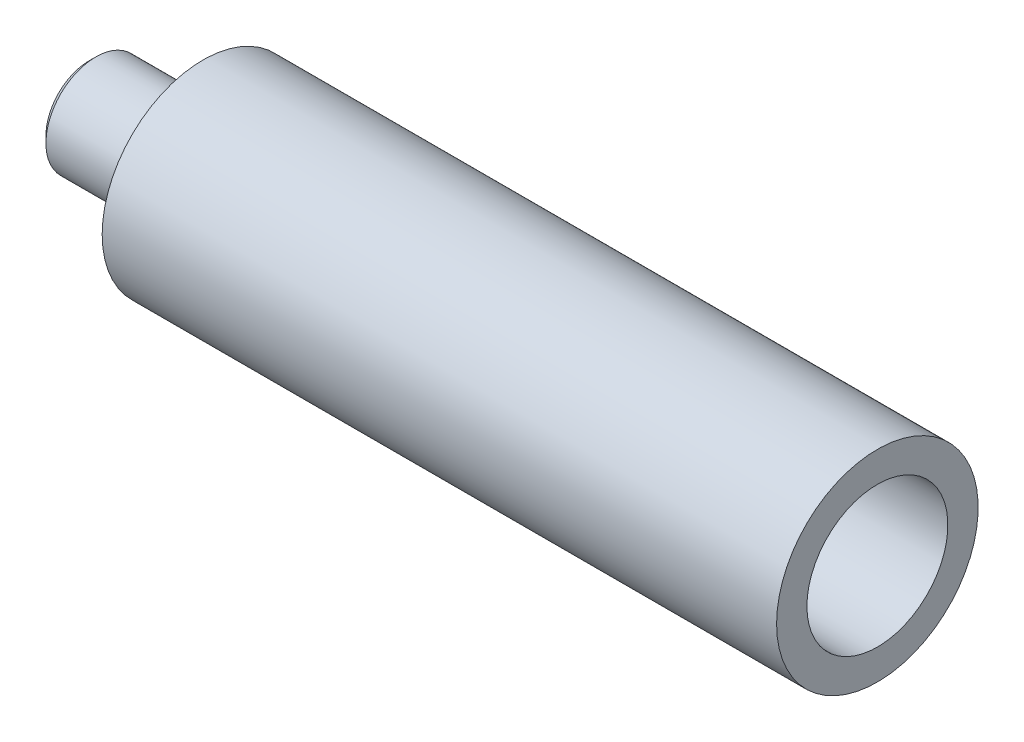
ISO-10303-21;
HEADER;
FILE_DESCRIPTION(('STEP AP214'),'2;1');
FILE_NAME('part.step','',(''),(''),'','','');
FILE_SCHEMA(('AUTOMOTIVE_DESIGN { 1 0 10303 214 1 1 1 1 }'));
ENDSEC;
DATA;
#1=APPLICATION_CONTEXT('core data for automotive mechanical design processes');
#2=APPLICATION_PROTOCOL_DEFINITION('international standard','automotive_design',2000,#1);
#3=PRODUCT_CONTEXT('',#1,'mechanical');
#4=PRODUCT('Part','Part','',(#3));
#5=PRODUCT_RELATED_PRODUCT_CATEGORY('part','',(#4));
#6=PRODUCT_DEFINITION_FORMATION('','',#4);
#7=PRODUCT_DEFINITION_CONTEXT('part definition',#1,'design');
#8=PRODUCT_DEFINITION('design','',#6,#7);
#9=PRODUCT_DEFINITION_SHAPE('','',#8);
#10=(LENGTH_UNIT() NAMED_UNIT(*) SI_UNIT(.MILLI.,.METRE.));
#11=(NAMED_UNIT(*) PLANE_ANGLE_UNIT() SI_UNIT($,.RADIAN.));
#12=(NAMED_UNIT(*) SI_UNIT($,.STERADIAN.) SOLID_ANGLE_UNIT());
#13=UNCERTAINTY_MEASURE_WITH_UNIT(LENGTH_MEASURE(1.E-05),#10,'distance_accuracy_value','');
#14=(GEOMETRIC_REPRESENTATION_CONTEXT(3) GLOBAL_UNCERTAINTY_ASSIGNED_CONTEXT((#13)) GLOBAL_UNIT_ASSIGNED_CONTEXT((#10,
#11,#12)) REPRESENTATION_CONTEXT('',''));
#15=CARTESIAN_POINT('',(0.,0.,0.));
#16=DIRECTION('',(0.,0.,1.));
#17=DIRECTION('',(1.,0.,0.));
#18=AXIS2_PLACEMENT_3D('',#15,#16,#17);
#19=CARTESIAN_POINT('',(0.,0.,0.));
#20=DIRECTION('',(1.,0.,0.));
#21=DIRECTION('',(0.,0.,-1.));
#22=AXIS2_PLACEMENT_3D('',#19,#20,#21);
#23=PLANE('',#22);
#24=CARTESIAN_POINT('',(0.,0.,0.));
#25=DIRECTION('',(-1.,0.,0.));
#26=DIRECTION('',(0.,0.,1.));
#27=AXIS2_PLACEMENT_3D('',#24,#25,#26);
#28=CIRCLE('',#27,3.);
#29=CARTESIAN_POINT('',(0.,0.,3.));
#30=VERTEX_POINT('',#29);
#31=EDGE_CURVE('E77',#30,#30,#28,.T.);
#32=ORIENTED_EDGE('',*,*,#31,.F.);
#33=EDGE_LOOP('',(#32));
#34=FACE_BOUND('',#33,.T.);
#35=CARTESIAN_POINT('',(0.,0.,0.));
#36=DIRECTION('',(1.,0.,0.));
#37=DIRECTION('',(0.,0.,-1.));
#38=AXIS2_PLACEMENT_3D('',#35,#36,#37);
#39=CIRCLE('',#38,5.7225);
#40=CARTESIAN_POINT('',(0.,0.,-5.7225));
#41=VERTEX_POINT('',#40);
#42=EDGE_CURVE('E89',#41,#41,#39,.T.);
#43=ORIENTED_EDGE('',*,*,#42,.F.);
#44=EDGE_LOOP('',(#43));
#45=FACE_BOUND('',#44,.T.);
#46=ADVANCED_FACE('F49',(#34,#45),#23,.F.);
#47=CARTESIAN_POINT('',(0.,0.,0.));
#48=DIRECTION('',(-1.,0.,0.));
#49=DIRECTION('',(0.,0.,1.));
#50=AXIS2_PLACEMENT_3D('',#47,#48,#49);
#51=CYLINDRICAL_SURFACE('',#50,13.3);
#52=CARTESIAN_POINT('',(104.,0.,0.));
#53=DIRECTION('',(-1.,0.,0.));
#54=DIRECTION('',(0.,0.,1.));
#55=AXIS2_PLACEMENT_3D('',#52,#53,#54);
#56=CIRCLE('',#55,13.3);
#57=CARTESIAN_POINT('',(104.,0.,13.3));
#58=VERTEX_POINT('',#57);
#59=EDGE_CURVE('E10',#58,#58,#56,.T.);
#60=ORIENTED_EDGE('',*,*,#59,.T.);
#61=EDGE_LOOP('',(#60));
#62=FACE_BOUND('',#61,.T.);
#63=CARTESIAN_POINT('',(15.,0.,0.));
#64=DIRECTION('',(-1.,0.,0.));
#65=DIRECTION('',(0.,0.,1.));
#66=AXIS2_PLACEMENT_3D('',#63,#64,#65);
#67=CIRCLE('',#66,13.3);
#68=CARTESIAN_POINT('',(15.,0.,13.3));
#69=VERTEX_POINT('',#68);
#70=EDGE_CURVE('E81',#69,#69,#67,.T.);
#71=ORIENTED_EDGE('',*,*,#70,.F.);
#72=EDGE_LOOP('',(#71));
#73=FACE_BOUND('',#72,.T.);
#74=ADVANCED_FACE('F51',(#62,#73),#51,.T.);
#75=CARTESIAN_POINT('',(104.,0.,0.));
#76=DIRECTION('',(1.,0.,0.));
#77=DIRECTION('',(0.,0.,-1.));
#78=AXIS2_PLACEMENT_3D('',#75,#76,#77);
#79=PLANE('',#78);
#80=CARTESIAN_POINT('',(104.,0.,0.));
#81=DIRECTION('',(-1.,0.,0.));
#82=DIRECTION('',(0.,0.,1.));
#83=AXIS2_PLACEMENT_3D('',#80,#81,#82);
#84=CIRCLE('',#83,9.3);
#85=CARTESIAN_POINT('',(104.,0.,9.3));
#86=VERTEX_POINT('',#85);
#87=EDGE_CURVE('E57',#86,#86,#84,.T.);
#88=ORIENTED_EDGE('',*,*,#87,.T.);
#89=EDGE_LOOP('',(#88));
#90=FACE_BOUND('',#89,.T.);
#91=ORIENTED_EDGE('',*,*,#59,.F.);
#92=EDGE_LOOP('',(#91));
#93=FACE_BOUND('',#92,.T.);
#94=ADVANCED_FACE('F114',(#90,#93),#79,.T.);
#95=CARTESIAN_POINT('',(0.,0.,0.));
#96=DIRECTION('',(-1.,0.,0.));
#97=DIRECTION('',(0.,0.,1.));
#98=AXIS2_PLACEMENT_3D('',#95,#96,#97);
#99=CYLINDRICAL_SURFACE('',#98,9.3);
#100=ORIENTED_EDGE('',*,*,#87,.F.);
#101=EDGE_LOOP('',(#100));
#102=FACE_BOUND('',#101,.T.);
#103=CARTESIAN_POINT('',(19.,0.,0.));
#104=DIRECTION('',(-1.,0.,0.));
#105=DIRECTION('',(0.,0.,1.));
#106=AXIS2_PLACEMENT_3D('',#103,#104,#105);
#107=CIRCLE('',#106,9.3);
#108=CARTESIAN_POINT('',(19.,0.,9.3));
#109=VERTEX_POINT('',#108);
#110=EDGE_CURVE('E64',#109,#109,#107,.T.);
#111=ORIENTED_EDGE('',*,*,#110,.T.);
#112=EDGE_LOOP('',(#111));
#113=FACE_BOUND('',#112,.T.);
#114=ADVANCED_FACE('F127',(#102,#113),#99,.F.);
#115=CARTESIAN_POINT('',(19.,0.,0.));
#116=DIRECTION('',(-1.,0.,0.));
#117=DIRECTION('',(0.,0.,1.));
#118=AXIS2_PLACEMENT_3D('',#115,#116,#117);
#119=PLANE('',#118);
#120=ORIENTED_EDGE('',*,*,#110,.F.);
#121=EDGE_LOOP('',(#120));
#122=FACE_BOUND('',#121,.T.);
#123=CARTESIAN_POINT('',(19.,0.,0.));
#124=DIRECTION('',(-1.,0.,0.));
#125=DIRECTION('',(0.,0.,1.));
#126=AXIS2_PLACEMENT_3D('',#123,#124,#125);
#127=CIRCLE('',#126,3.);
#128=CARTESIAN_POINT('',(19.,0.,3.));
#129=VERTEX_POINT('',#128);
#130=EDGE_CURVE('E71',#129,#129,#127,.T.);
#131=ORIENTED_EDGE('',*,*,#130,.T.);
#132=EDGE_LOOP('',(#131));
#133=FACE_BOUND('',#132,.T.);
#134=ADVANCED_FACE('F123',(#122,#133),#119,.F.);
#135=CARTESIAN_POINT('',(0.,0.,0.));
#136=DIRECTION('',(-1.,0.,0.));
#137=DIRECTION('',(0.,0.,1.));
#138=AXIS2_PLACEMENT_3D('',#135,#136,#137);
#139=CYLINDRICAL_SURFACE('',#138,3.);
#140=ORIENTED_EDGE('',*,*,#130,.F.);
#141=EDGE_LOOP('',(#140));
#142=FACE_BOUND('',#141,.T.);
#143=ORIENTED_EDGE('',*,*,#31,.T.);
#144=EDGE_LOOP('',(#143));
#145=FACE_BOUND('',#144,.T.);
#146=ADVANCED_FACE('F120',(#142,#145),#139,.F.);
#147=CARTESIAN_POINT('',(15.,0.,0.));
#148=DIRECTION('',(-1.,0.,0.));
#149=DIRECTION('',(0.,0.,1.));
#150=AXIS2_PLACEMENT_3D('',#147,#148,#149);
#151=PLANE('',#150);
#152=ORIENTED_EDGE('',*,*,#70,.T.);
#153=EDGE_LOOP('',(#152));
#154=FACE_BOUND('',#153,.T.);
#155=CARTESIAN_POINT('',(15.,0.,0.));
#156=DIRECTION('',(1.,0.,0.));
#157=DIRECTION('',(0.,0.,-1.));
#158=AXIS2_PLACEMENT_3D('',#155,#156,#157);
#159=CIRCLE('',#158,6.5785);
#160=CARTESIAN_POINT('',(15.,0.,-6.5785));
#161=VERTEX_POINT('',#160);
#162=EDGE_CURVE('E85',#161,#161,#159,.T.);
#163=ORIENTED_EDGE('',*,*,#162,.T.);
#164=EDGE_LOOP('',(#163));
#165=FACE_BOUND('',#164,.T.);
#166=ADVANCED_FACE('F118',(#154,#165),#151,.T.);
#167=CARTESIAN_POINT('',(0.,0.,0.));
#168=DIRECTION('',(1.,0.,0.));
#169=DIRECTION('',(0.,0.,-1.));
#170=AXIS2_PLACEMENT_3D('',#167,#168,#169);
#171=CYLINDRICAL_SURFACE('',#170,6.5785);
#172=ORIENTED_EDGE('',*,*,#162,.F.);
#173=EDGE_LOOP('',(#172));
#174=FACE_BOUND('',#173,.T.);
#175=CARTESIAN_POINT('',(0.855999999999999,0.,0.));
#176=DIRECTION('',(1.,0.,0.));
#177=DIRECTION('',(0.,0.,-1.));
#178=AXIS2_PLACEMENT_3D('',#175,#176,#177);
#179=CIRCLE('',#178,6.5785);
#180=CARTESIAN_POINT('',(0.855999999999999,0.,-6.5785));
#181=VERTEX_POINT('',#180);
#182=EDGE_CURVE('E93',#181,#181,#179,.T.);
#183=ORIENTED_EDGE('',*,*,#182,.T.);
#184=EDGE_LOOP('',(#183));
#185=FACE_BOUND('',#184,.T.);
#186=ADVANCED_FACE('F100',(#174,#185),#171,.T.);
#187=CARTESIAN_POINT('',(0.,0.,0.));
#188=DIRECTION('',(1.,0.,0.));
#189=DIRECTION('',(0.,0.,-1.));
#190=AXIS2_PLACEMENT_3D('',#187,#188,#189);
#191=CONICAL_SURFACE('',#190,5.7225,0.785398163397449);
#192=ORIENTED_EDGE('',*,*,#182,.F.);
#193=EDGE_LOOP('',(#192));
#194=FACE_BOUND('',#193,.T.);
#195=ORIENTED_EDGE('',*,*,#42,.T.);
#196=EDGE_LOOP('',(#195));
#197=FACE_BOUND('',#196,.T.);
#198=ADVANCED_FACE('F102',(#194,#197),#191,.T.);
#199=CLOSED_SHELL('',(#46,#74,#94,#114,#134,#146,#166,#186,#198));
#200=MANIFOLD_SOLID_BREP('B2',#199);
#201=ADVANCED_BREP_SHAPE_REPRESENTATION('',(#18,#200),#14);
#202=SHAPE_DEFINITION_REPRESENTATION(#9,#201);
ENDSEC;
END-ISO-10303-21;
